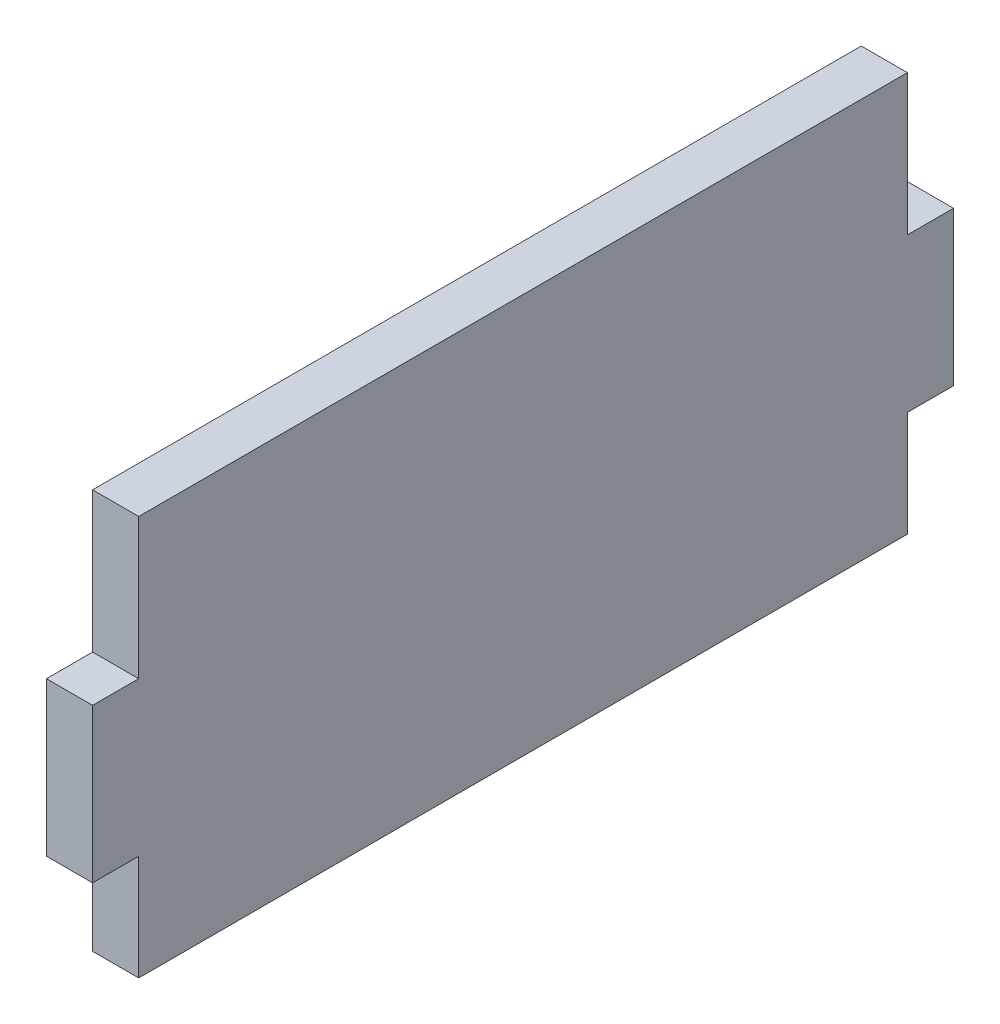
ISO-10303-21;
HEADER;
FILE_DESCRIPTION(('STEP AP214'),'2;1');
FILE_NAME('part.step','',(''),(''),'','','');
FILE_SCHEMA(('AUTOMOTIVE_DESIGN { 1 0 10303 214 1 1 1 1 }'));
ENDSEC;
DATA;
#1=APPLICATION_CONTEXT('core data for automotive mechanical design processes');
#2=APPLICATION_PROTOCOL_DEFINITION('international standard','automotive_design',2000,#1);
#3=PRODUCT_CONTEXT('',#1,'mechanical');
#4=PRODUCT('Part','Part','',(#3));
#5=PRODUCT_RELATED_PRODUCT_CATEGORY('part','',(#4));
#6=PRODUCT_DEFINITION_FORMATION('','',#4);
#7=PRODUCT_DEFINITION_CONTEXT('part definition',#1,'design');
#8=PRODUCT_DEFINITION('design','',#6,#7);
#9=PRODUCT_DEFINITION_SHAPE('','',#8);
#10=(LENGTH_UNIT() NAMED_UNIT(*) SI_UNIT(.MILLI.,.METRE.));
#11=(NAMED_UNIT(*) PLANE_ANGLE_UNIT() SI_UNIT($,.RADIAN.));
#12=(NAMED_UNIT(*) SI_UNIT($,.STERADIAN.) SOLID_ANGLE_UNIT());
#13=UNCERTAINTY_MEASURE_WITH_UNIT(LENGTH_MEASURE(1.E-05),#10,'distance_accuracy_value','');
#14=(GEOMETRIC_REPRESENTATION_CONTEXT(3) GLOBAL_UNCERTAINTY_ASSIGNED_CONTEXT((#13)) GLOBAL_UNIT_ASSIGNED_CONTEXT((#10,
#11,#12)) REPRESENTATION_CONTEXT('',''));
#15=CARTESIAN_POINT('',(0.,0.,0.));
#16=DIRECTION('',(0.,0.,1.));
#17=DIRECTION('',(1.,0.,0.));
#18=AXIS2_PLACEMENT_3D('',#15,#16,#17);
#19=CARTESIAN_POINT('',(3.,0.,0.));
#20=DIRECTION('',(0.,0.,-1.));
#21=DIRECTION('',(-1.,0.,0.));
#22=AXIS2_PLACEMENT_3D('',#19,#20,#21);
#23=PLANE('',#22);
#24=DIRECTION('',(0.,-1.,0.));
#25=VECTOR('',#24,1.);
#26=CARTESIAN_POINT('',(0.,0.,0.));
#27=LINE('',#26,#25);
#28=CARTESIAN_POINT('',(0.,6.86,0.));
#29=VERTEX_POINT('',#28);
#30=CARTESIAN_POINT('',(0.,0.,0.));
#31=VERTEX_POINT('',#30);
#32=EDGE_CURVE('E159',#29,#31,#27,.T.);
#33=ORIENTED_EDGE('',*,*,#32,.T.);
#34=DIRECTION('',(-1.,0.,0.));
#35=VECTOR('',#34,1.);
#36=CARTESIAN_POINT('',(3.,0.,0.));
#37=LINE('',#36,#35);
#38=CARTESIAN_POINT('',(3.,0.,0.));
#39=VERTEX_POINT('',#38);
#40=EDGE_CURVE('E11',#39,#31,#37,.T.);
#41=ORIENTED_EDGE('',*,*,#40,.F.);
#42=DIRECTION('',(0.,-1.,0.));
#43=VECTOR('',#42,1.);
#44=CARTESIAN_POINT('',(3.,0.,0.));
#45=LINE('',#44,#43);
#46=CARTESIAN_POINT('',(3.,6.86,0.));
#47=VERTEX_POINT('',#46);
#48=EDGE_CURVE('E181',#47,#39,#45,.T.);
#49=ORIENTED_EDGE('',*,*,#48,.F.);
#50=DIRECTION('',(-1.,0.,0.));
#51=VECTOR('',#50,1.);
#52=CARTESIAN_POINT('',(3.,6.86,0.));
#53=LINE('',#52,#51);
#54=EDGE_CURVE('E155',#47,#29,#53,.T.);
#55=ORIENTED_EDGE('',*,*,#54,.T.);
#56=EDGE_LOOP('',(#33,#41,#49,#55));
#57=FACE_BOUND('',#56,.T.);
#58=ADVANCED_FACE('F39',(#57),#23,.F.);
#59=CARTESIAN_POINT('',(3.,0.,0.));
#60=DIRECTION('',(0.,1.,0.));
#61=DIRECTION('',(0.,0.,1.));
#62=AXIS2_PLACEMENT_3D('',#59,#60,#61);
#63=PLANE('',#62);
#64=DIRECTION('',(0.,0.,-1.));
#65=VECTOR('',#64,1.);
#66=CARTESIAN_POINT('',(0.,0.,0.));
#67=LINE('',#66,#65);
#68=CARTESIAN_POINT('',(0.,0.,-50.));
#69=VERTEX_POINT('',#68);
#70=EDGE_CURVE('E162',#31,#69,#67,.T.);
#71=ORIENTED_EDGE('',*,*,#70,.T.);
#72=DIRECTION('',(-1.,0.,0.));
#73=VECTOR('',#72,1.);
#74=CARTESIAN_POINT('',(3.,0.,-50.));
#75=LINE('',#74,#73);
#76=CARTESIAN_POINT('',(3.,0.,-50.));
#77=VERTEX_POINT('',#76);
#78=EDGE_CURVE('E47',#77,#69,#75,.T.);
#79=ORIENTED_EDGE('',*,*,#78,.F.);
#80=DIRECTION('',(0.,0.,-1.));
#81=VECTOR('',#80,1.);
#82=CARTESIAN_POINT('',(3.,0.,0.));
#83=LINE('',#82,#81);
#84=EDGE_CURVE('E110',#39,#77,#83,.T.);
#85=ORIENTED_EDGE('',*,*,#84,.F.);
#86=ORIENTED_EDGE('',*,*,#40,.T.);
#87=EDGE_LOOP('',(#71,#79,#85,#86));
#88=FACE_BOUND('',#87,.T.);
#89=ADVANCED_FACE('F259',(#88),#63,.F.);
#90=CARTESIAN_POINT('',(3.,0.,-50.));
#91=DIRECTION('',(0.,0.,1.));
#92=DIRECTION('',(1.,0.,0.));
#93=AXIS2_PLACEMENT_3D('',#90,#91,#92);
#94=PLANE('',#93);
#95=DIRECTION('',(0.,1.,0.));
#96=VECTOR('',#95,1.);
#97=CARTESIAN_POINT('',(0.,0.,-50.));
#98=LINE('',#97,#96);
#99=CARTESIAN_POINT('',(0.,6.86,-50.));
#100=VERTEX_POINT('',#99);
#101=EDGE_CURVE('E164',#69,#100,#98,.T.);
#102=ORIENTED_EDGE('',*,*,#101,.T.);
#103=DIRECTION('',(-1.,0.,0.));
#104=VECTOR('',#103,1.);
#105=CARTESIAN_POINT('',(3.,6.86,-50.));
#106=LINE('',#105,#104);
#107=CARTESIAN_POINT('',(3.,6.86,-50.));
#108=VERTEX_POINT('',#107);
#109=EDGE_CURVE('E200',#108,#100,#106,.T.);
#110=ORIENTED_EDGE('',*,*,#109,.F.);
#111=DIRECTION('',(0.,1.,0.));
#112=VECTOR('',#111,1.);
#113=CARTESIAN_POINT('',(3.,0.,-50.));
#114=LINE('',#113,#112);
#115=EDGE_CURVE('E208',#77,#108,#114,.T.);
#116=ORIENTED_EDGE('',*,*,#115,.F.);
#117=ORIENTED_EDGE('',*,*,#78,.T.);
#118=EDGE_LOOP('',(#102,#110,#116,#117));
#119=FACE_BOUND('',#118,.T.);
#120=ADVANCED_FACE('F206',(#119),#94,.F.);
#121=CARTESIAN_POINT('',(3.,6.86,-50.));
#122=DIRECTION('',(0.,1.,0.));
#123=DIRECTION('',(0.,0.,1.));
#124=AXIS2_PLACEMENT_3D('',#121,#122,#123);
#125=PLANE('',#124);
#126=DIRECTION('',(0.,0.,-1.));
#127=VECTOR('',#126,1.);
#128=CARTESIAN_POINT('',(0.,6.86,-50.));
#129=LINE('',#128,#127);
#130=CARTESIAN_POINT('',(0.,6.86,-53.));
#131=VERTEX_POINT('',#130);
#132=EDGE_CURVE('E166',#100,#131,#129,.T.);
#133=ORIENTED_EDGE('',*,*,#132,.T.);
#134=DIRECTION('',(-1.,0.,0.));
#135=VECTOR('',#134,1.);
#136=CARTESIAN_POINT('',(3.,6.86,-53.));
#137=LINE('',#136,#135);
#138=CARTESIAN_POINT('',(3.,6.86,-53.));
#139=VERTEX_POINT('',#138);
#140=EDGE_CURVE('E197',#139,#131,#137,.T.);
#141=ORIENTED_EDGE('',*,*,#140,.F.);
#142=DIRECTION('',(0.,0.,-1.));
#143=VECTOR('',#142,1.);
#144=CARTESIAN_POINT('',(3.,6.86,-50.));
#145=LINE('',#144,#143);
#146=EDGE_CURVE('E226',#108,#139,#145,.T.);
#147=ORIENTED_EDGE('',*,*,#146,.F.);
#148=ORIENTED_EDGE('',*,*,#109,.T.);
#149=EDGE_LOOP('',(#133,#141,#147,#148));
#150=FACE_BOUND('',#149,.T.);
#151=ADVANCED_FACE('F217',(#150),#125,.F.);
#152=CARTESIAN_POINT('',(3.,16.86,-53.));
#153=DIRECTION('',(0.,0.,1.));
#154=DIRECTION('',(1.,0.,0.));
#155=AXIS2_PLACEMENT_3D('',#152,#153,#154);
#156=PLANE('',#155);
#157=DIRECTION('',(0.,1.,0.));
#158=VECTOR('',#157,1.);
#159=CARTESIAN_POINT('',(0.,16.86,-53.));
#160=LINE('',#159,#158);
#161=CARTESIAN_POINT('',(0.,16.86,-53.));
#162=VERTEX_POINT('',#161);
#163=EDGE_CURVE('E168',#131,#162,#160,.T.);
#164=ORIENTED_EDGE('',*,*,#163,.T.);
#165=DIRECTION('',(-1.,0.,0.));
#166=VECTOR('',#165,1.);
#167=CARTESIAN_POINT('',(3.,16.86,-53.));
#168=LINE('',#167,#166);
#169=CARTESIAN_POINT('',(3.,16.86,-53.));
#170=VERTEX_POINT('',#169);
#171=EDGE_CURVE('E194',#170,#162,#168,.T.);
#172=ORIENTED_EDGE('',*,*,#171,.F.);
#173=DIRECTION('',(0.,1.,0.));
#174=VECTOR('',#173,1.);
#175=CARTESIAN_POINT('',(3.,16.86,-53.));
#176=LINE('',#175,#174);
#177=EDGE_CURVE('E223',#139,#170,#176,.T.);
#178=ORIENTED_EDGE('',*,*,#177,.F.);
#179=ORIENTED_EDGE('',*,*,#140,.T.);
#180=EDGE_LOOP('',(#164,#172,#178,#179));
#181=FACE_BOUND('',#180,.T.);
#182=ADVANCED_FACE('F221',(#181),#156,.F.);
#183=CARTESIAN_POINT('',(3.,16.86,-50.));
#184=DIRECTION('',(0.,-1.,0.));
#185=DIRECTION('',(0.,0.,-1.));
#186=AXIS2_PLACEMENT_3D('',#183,#184,#185);
#187=PLANE('',#186);
#188=DIRECTION('',(0.,0.,1.));
#189=VECTOR('',#188,1.);
#190=CARTESIAN_POINT('',(0.,16.86,-50.));
#191=LINE('',#190,#189);
#192=CARTESIAN_POINT('',(0.,16.86,-50.));
#193=VERTEX_POINT('',#192);
#194=EDGE_CURVE('E170',#162,#193,#191,.T.);
#195=ORIENTED_EDGE('',*,*,#194,.T.);
#196=DIRECTION('',(-1.,0.,0.));
#197=VECTOR('',#196,1.);
#198=CARTESIAN_POINT('',(3.,16.86,-50.));
#199=LINE('',#198,#197);
#200=CARTESIAN_POINT('',(3.,16.86,-50.));
#201=VERTEX_POINT('',#200);
#202=EDGE_CURVE('E191',#201,#193,#199,.T.);
#203=ORIENTED_EDGE('',*,*,#202,.F.);
#204=DIRECTION('',(0.,0.,1.));
#205=VECTOR('',#204,1.);
#206=CARTESIAN_POINT('',(3.,16.86,-50.));
#207=LINE('',#206,#205);
#208=EDGE_CURVE('E225',#170,#201,#207,.T.);
#209=ORIENTED_EDGE('',*,*,#208,.F.);
#210=ORIENTED_EDGE('',*,*,#171,.T.);
#211=EDGE_LOOP('',(#195,#203,#209,#210));
#212=FACE_BOUND('',#211,.T.);
#213=ADVANCED_FACE('F272',(#212),#187,.F.);
#214=CARTESIAN_POINT('',(3.,16.86,-50.));
#215=DIRECTION('',(0.,0.,1.));
#216=DIRECTION('',(1.,0.,0.));
#217=AXIS2_PLACEMENT_3D('',#214,#215,#216);
#218=PLANE('',#217);
#219=DIRECTION('',(0.,1.,0.));
#220=VECTOR('',#219,1.);
#221=CARTESIAN_POINT('',(0.,16.86,-50.));
#222=LINE('',#221,#220);
#223=CARTESIAN_POINT('',(0.,26.,-50.));
#224=VERTEX_POINT('',#223);
#225=EDGE_CURVE('E172',#193,#224,#222,.T.);
#226=ORIENTED_EDGE('',*,*,#225,.T.);
#227=DIRECTION('',(-1.,0.,0.));
#228=VECTOR('',#227,1.);
#229=CARTESIAN_POINT('',(3.,26.,-50.));
#230=LINE('',#229,#228);
#231=CARTESIAN_POINT('',(3.,26.,-50.));
#232=VERTEX_POINT('',#231);
#233=EDGE_CURVE('E188',#232,#224,#230,.T.);
#234=ORIENTED_EDGE('',*,*,#233,.F.);
#235=DIRECTION('',(0.,1.,0.));
#236=VECTOR('',#235,1.);
#237=CARTESIAN_POINT('',(3.,16.86,-50.));
#238=LINE('',#237,#236);
#239=EDGE_CURVE('E228',#201,#232,#238,.T.);
#240=ORIENTED_EDGE('',*,*,#239,.F.);
#241=ORIENTED_EDGE('',*,*,#202,.T.);
#242=EDGE_LOOP('',(#226,#234,#240,#241));
#243=FACE_BOUND('',#242,.T.);
#244=ADVANCED_FACE('F275',(#243),#218,.F.);
#245=CARTESIAN_POINT('',(3.,26.,0.));
#246=DIRECTION('',(0.,-1.,0.));
#247=DIRECTION('',(0.,0.,-1.));
#248=AXIS2_PLACEMENT_3D('',#245,#246,#247);
#249=PLANE('',#248);
#250=DIRECTION('',(0.,0.,1.));
#251=VECTOR('',#250,1.);
#252=CARTESIAN_POINT('',(0.,26.,0.));
#253=LINE('',#252,#251);
#254=CARTESIAN_POINT('',(0.,26.,0.));
#255=VERTEX_POINT('',#254);
#256=EDGE_CURVE('E174',#224,#255,#253,.T.);
#257=ORIENTED_EDGE('',*,*,#256,.T.);
#258=DIRECTION('',(-1.,0.,0.));
#259=VECTOR('',#258,1.);
#260=CARTESIAN_POINT('',(3.,26.,0.));
#261=LINE('',#260,#259);
#262=CARTESIAN_POINT('',(3.,26.,0.));
#263=VERTEX_POINT('',#262);
#264=EDGE_CURVE('E185',#263,#255,#261,.T.);
#265=ORIENTED_EDGE('',*,*,#264,.F.);
#266=DIRECTION('',(0.,0.,1.));
#267=VECTOR('',#266,1.);
#268=CARTESIAN_POINT('',(3.,26.,0.));
#269=LINE('',#268,#267);
#270=EDGE_CURVE('E234',#232,#263,#269,.T.);
#271=ORIENTED_EDGE('',*,*,#270,.F.);
#272=ORIENTED_EDGE('',*,*,#233,.T.);
#273=EDGE_LOOP('',(#257,#265,#271,#272));
#274=FACE_BOUND('',#273,.T.);
#275=ADVANCED_FACE('F240',(#274),#249,.F.);
#276=CARTESIAN_POINT('',(3.,16.86,0.));
#277=DIRECTION('',(0.,0.,-1.));
#278=DIRECTION('',(0.,1.,0.));
#279=AXIS2_PLACEMENT_3D('',#276,#277,#278);
#280=PLANE('',#279);
#281=DIRECTION('',(0.,-1.,0.));
#282=VECTOR('',#281,1.);
#283=CARTESIAN_POINT('',(0.,16.86,0.));
#284=LINE('',#283,#282);
#285=CARTESIAN_POINT('',(0.,16.86,0.));
#286=VERTEX_POINT('',#285);
#287=EDGE_CURVE('E176',#255,#286,#284,.T.);
#288=ORIENTED_EDGE('',*,*,#287,.T.);
#289=DIRECTION('',(-1.,0.,0.));
#290=VECTOR('',#289,1.);
#291=CARTESIAN_POINT('',(3.,16.86,0.));
#292=LINE('',#291,#290);
#293=CARTESIAN_POINT('',(3.,16.86,0.));
#294=VERTEX_POINT('',#293);
#295=EDGE_CURVE('E150',#294,#286,#292,.T.);
#296=ORIENTED_EDGE('',*,*,#295,.F.);
#297=DIRECTION('',(0.,-1.,0.));
#298=VECTOR('',#297,1.);
#299=CARTESIAN_POINT('',(3.,16.86,0.));
#300=LINE('',#299,#298);
#301=EDGE_CURVE('E141',#263,#294,#300,.T.);
#302=ORIENTED_EDGE('',*,*,#301,.F.);
#303=ORIENTED_EDGE('',*,*,#264,.T.);
#304=EDGE_LOOP('',(#288,#296,#302,#303));
#305=FACE_BOUND('',#304,.T.);
#306=ADVANCED_FACE('F244',(#305),#280,.F.);
#307=CARTESIAN_POINT('',(3.,16.86,0.));
#308=DIRECTION('',(0.,-1.,0.));
#309=DIRECTION('',(0.,0.,-1.));
#310=AXIS2_PLACEMENT_3D('',#307,#308,#309);
#311=PLANE('',#310);
#312=DIRECTION('',(0.,0.,1.));
#313=VECTOR('',#312,1.);
#314=CARTESIAN_POINT('',(0.,16.86,0.));
#315=LINE('',#314,#313);
#316=CARTESIAN_POINT('',(0.,16.86,3.));
#317=VERTEX_POINT('',#316);
#318=EDGE_CURVE('E149',#286,#317,#315,.T.);
#319=ORIENTED_EDGE('',*,*,#318,.T.);
#320=DIRECTION('',(-1.,0.,0.));
#321=VECTOR('',#320,1.);
#322=CARTESIAN_POINT('',(3.,16.86,3.));
#323=LINE('',#322,#321);
#324=CARTESIAN_POINT('',(3.,16.86,3.));
#325=VERTEX_POINT('',#324);
#326=EDGE_CURVE('E146',#325,#317,#323,.T.);
#327=ORIENTED_EDGE('',*,*,#326,.F.);
#328=DIRECTION('',(0.,0.,1.));
#329=VECTOR('',#328,1.);
#330=CARTESIAN_POINT('',(3.,16.86,0.));
#331=LINE('',#330,#329);
#332=EDGE_CURVE('E135',#294,#325,#331,.T.);
#333=ORIENTED_EDGE('',*,*,#332,.F.);
#334=ORIENTED_EDGE('',*,*,#295,.T.);
#335=EDGE_LOOP('',(#319,#327,#333,#334));
#336=FACE_BOUND('',#335,.T.);
#337=ADVANCED_FACE('F147',(#336),#311,.F.);
#338=CARTESIAN_POINT('',(3.,16.86,3.));
#339=DIRECTION('',(0.,0.,-1.));
#340=DIRECTION('',(0.,1.,0.));
#341=AXIS2_PLACEMENT_3D('',#338,#339,#340);
#342=PLANE('',#341);
#343=DIRECTION('',(0.,-1.,0.));
#344=VECTOR('',#343,1.);
#345=CARTESIAN_POINT('',(0.,16.86,3.));
#346=LINE('',#345,#344);
#347=CARTESIAN_POINT('',(0.,6.86,3.));
#348=VERTEX_POINT('',#347);
#349=EDGE_CURVE('E96',#317,#348,#346,.T.);
#350=ORIENTED_EDGE('',*,*,#349,.T.);
#351=DIRECTION('',(-1.,0.,0.));
#352=VECTOR('',#351,1.);
#353=CARTESIAN_POINT('',(3.,6.86,3.));
#354=LINE('',#353,#352);
#355=CARTESIAN_POINT('',(3.,6.86,3.));
#356=VERTEX_POINT('',#355);
#357=EDGE_CURVE('E151',#356,#348,#354,.T.);
#358=ORIENTED_EDGE('',*,*,#357,.F.);
#359=DIRECTION('',(0.,-1.,0.));
#360=VECTOR('',#359,1.);
#361=CARTESIAN_POINT('',(3.,16.86,3.));
#362=LINE('',#361,#360);
#363=EDGE_CURVE('E139',#325,#356,#362,.T.);
#364=ORIENTED_EDGE('',*,*,#363,.F.);
#365=ORIENTED_EDGE('',*,*,#326,.T.);
#366=EDGE_LOOP('',(#350,#358,#364,#365));
#367=FACE_BOUND('',#366,.T.);
#368=ADVANCED_FACE('F153',(#367),#342,.F.);
#369=CARTESIAN_POINT('',(3.,6.86,0.));
#370=DIRECTION('',(0.,1.,0.));
#371=DIRECTION('',(0.,0.,1.));
#372=AXIS2_PLACEMENT_3D('',#369,#370,#371);
#373=PLANE('',#372);
#374=DIRECTION('',(0.,0.,-1.));
#375=VECTOR('',#374,1.);
#376=CARTESIAN_POINT('',(0.,6.86,0.));
#377=LINE('',#376,#375);
#378=EDGE_CURVE('E102',#348,#29,#377,.T.);
#379=ORIENTED_EDGE('',*,*,#378,.T.);
#380=ORIENTED_EDGE('',*,*,#54,.F.);
#381=DIRECTION('',(0.,0.,-1.));
#382=VECTOR('',#381,1.);
#383=CARTESIAN_POINT('',(3.,6.86,0.));
#384=LINE('',#383,#382);
#385=EDGE_CURVE('E55',#356,#47,#384,.T.);
#386=ORIENTED_EDGE('',*,*,#385,.F.);
#387=ORIENTED_EDGE('',*,*,#357,.T.);
#388=EDGE_LOOP('',(#379,#380,#386,#387));
#389=FACE_BOUND('',#388,.T.);
#390=ADVANCED_FACE('F248',(#389),#373,.F.);
#391=CARTESIAN_POINT('',(3.,0.,0.));
#392=DIRECTION('',(1.,0.,0.));
#393=DIRECTION('',(0.,0.,-1.));
#394=AXIS2_PLACEMENT_3D('',#391,#392,#393);
#395=PLANE('',#394);
#396=ORIENTED_EDGE('',*,*,#48,.T.);
#397=ORIENTED_EDGE('',*,*,#84,.T.);
#398=ORIENTED_EDGE('',*,*,#115,.T.);
#399=ORIENTED_EDGE('',*,*,#146,.T.);
#400=ORIENTED_EDGE('',*,*,#177,.T.);
#401=ORIENTED_EDGE('',*,*,#208,.T.);
#402=ORIENTED_EDGE('',*,*,#239,.T.);
#403=ORIENTED_EDGE('',*,*,#270,.T.);
#404=ORIENTED_EDGE('',*,*,#301,.T.);
#405=ORIENTED_EDGE('',*,*,#332,.T.);
#406=ORIENTED_EDGE('',*,*,#363,.T.);
#407=ORIENTED_EDGE('',*,*,#385,.T.);
#408=EDGE_LOOP('',(#396,#397,#398,#399,#400,#401,#402,#403,#404,#405,#406,#407));
#409=FACE_BOUND('',#408,.T.);
#410=ADVANCED_FACE('F137',(#409),#395,.T.);
#411=CARTESIAN_POINT('',(0.,0.,0.));
#412=DIRECTION('',(1.,0.,0.));
#413=DIRECTION('',(0.,0.,-1.));
#414=AXIS2_PLACEMENT_3D('',#411,#412,#413);
#415=PLANE('',#414);
#416=ORIENTED_EDGE('',*,*,#32,.F.);
#417=ORIENTED_EDGE('',*,*,#378,.F.);
#418=ORIENTED_EDGE('',*,*,#349,.F.);
#419=ORIENTED_EDGE('',*,*,#318,.F.);
#420=ORIENTED_EDGE('',*,*,#287,.F.);
#421=ORIENTED_EDGE('',*,*,#256,.F.);
#422=ORIENTED_EDGE('',*,*,#225,.F.);
#423=ORIENTED_EDGE('',*,*,#194,.F.);
#424=ORIENTED_EDGE('',*,*,#163,.F.);
#425=ORIENTED_EDGE('',*,*,#132,.F.);
#426=ORIENTED_EDGE('',*,*,#101,.F.);
#427=ORIENTED_EDGE('',*,*,#70,.F.);
#428=EDGE_LOOP('',(#416,#417,#418,#419,#420,#421,#422,#423,#424,#425,#426,#427));
#429=FACE_BOUND('',#428,.T.);
#430=ADVANCED_FACE('F212',(#429),#415,.F.);
#431=CLOSED_SHELL('',(#58,#89,#120,#151,#182,#213,#244,#275,#306,#337,#368,#390,#410,#430));
#432=MANIFOLD_SOLID_BREP('B2',#431);
#433=ADVANCED_BREP_SHAPE_REPRESENTATION('',(#18,#432),#14);
#434=SHAPE_DEFINITION_REPRESENTATION(#9,#433);
ENDSEC;
END-ISO-10303-21;
